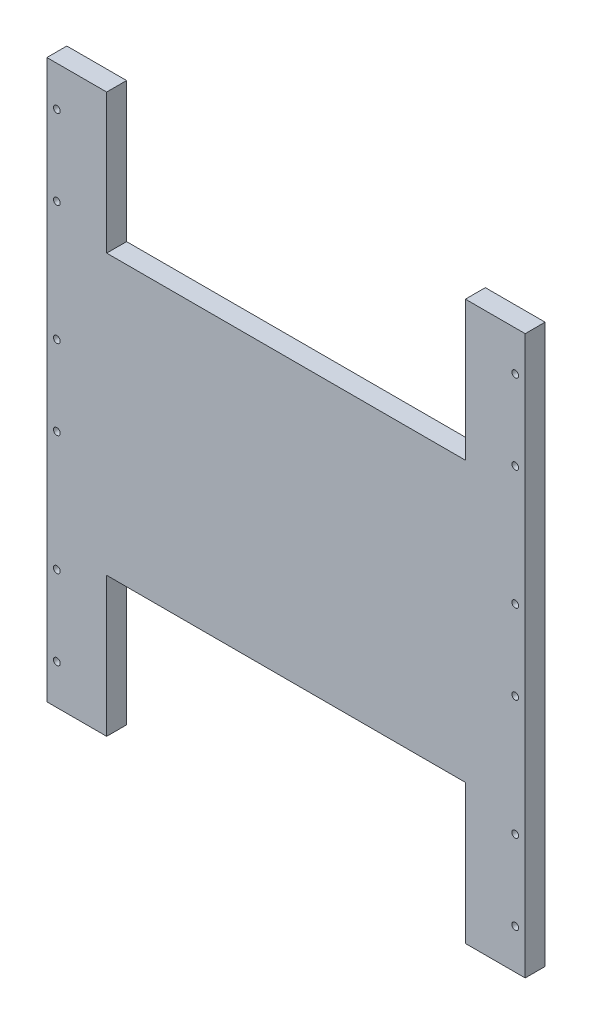
ISO-10303-21;
HEADER;
FILE_DESCRIPTION(('STEP AP214'),'2;1');
FILE_NAME('part.step','',(''),(''),'','','');
FILE_SCHEMA(('AUTOMOTIVE_DESIGN { 1 0 10303 214 1 1 1 1 }'));
ENDSEC;
DATA;
#1=APPLICATION_CONTEXT('core data for automotive mechanical design processes');
#2=APPLICATION_PROTOCOL_DEFINITION('international standard','automotive_design',2000,#1);
#3=PRODUCT_CONTEXT('',#1,'mechanical');
#4=PRODUCT('Part','Part','',(#3));
#5=PRODUCT_RELATED_PRODUCT_CATEGORY('part','',(#4));
#6=PRODUCT_DEFINITION_FORMATION('','',#4);
#7=PRODUCT_DEFINITION_CONTEXT('part definition',#1,'design');
#8=PRODUCT_DEFINITION('design','',#6,#7);
#9=PRODUCT_DEFINITION_SHAPE('','',#8);
#10=(LENGTH_UNIT() NAMED_UNIT(*) SI_UNIT(.MILLI.,.METRE.));
#11=(NAMED_UNIT(*) PLANE_ANGLE_UNIT() SI_UNIT($,.RADIAN.));
#12=(NAMED_UNIT(*) SI_UNIT($,.STERADIAN.) SOLID_ANGLE_UNIT());
#13=UNCERTAINTY_MEASURE_WITH_UNIT(LENGTH_MEASURE(1.E-05),#10,'distance_accuracy_value','');
#14=(GEOMETRIC_REPRESENTATION_CONTEXT(3) GLOBAL_UNCERTAINTY_ASSIGNED_CONTEXT((#13)) GLOBAL_UNIT_ASSIGNED_CONTEXT((#10,
#11,#12)) REPRESENTATION_CONTEXT('',''));
#15=CARTESIAN_POINT('',(0.,0.,0.));
#16=DIRECTION('',(0.,0.,1.));
#17=DIRECTION('',(1.,0.,0.));
#18=AXIS2_PLACEMENT_3D('',#15,#16,#17);
#19=CARTESIAN_POINT('',(0.,355.6,12.7));
#20=DIRECTION('',(0.,-1.,0.));
#21=DIRECTION('',(0.,0.,-1.));
#22=AXIS2_PLACEMENT_3D('',#19,#20,#21);
#23=PLANE('',#22);
#24=DIRECTION('',(-1.,0.,0.));
#25=VECTOR('',#24,1.);
#26=CARTESIAN_POINT('',(0.,355.6,12.7));
#27=LINE('',#26,#25);
#28=CARTESIAN_POINT('',(38.0999999999999,355.6,12.7));
#29=VERTEX_POINT('',#28);
#30=CARTESIAN_POINT('',(0.,355.6,12.7));
#31=VERTEX_POINT('',#30);
#32=EDGE_CURVE('E195',#29,#31,#27,.T.);
#33=ORIENTED_EDGE('',*,*,#32,.F.);
#34=DIRECTION('',(0.,0.,1.));
#35=VECTOR('',#34,1.);
#36=CARTESIAN_POINT('',(38.0999999999999,355.6,0.));
#37=LINE('',#36,#35);
#38=CARTESIAN_POINT('',(38.0999999999999,355.6,0.));
#39=VERTEX_POINT('',#38);
#40=EDGE_CURVE('E154',#39,#29,#37,.T.);
#41=ORIENTED_EDGE('',*,*,#40,.F.);
#42=DIRECTION('',(-1.,0.,0.));
#43=VECTOR('',#42,1.);
#44=CARTESIAN_POINT('',(0.,355.6,0.));
#45=LINE('',#44,#43);
#46=CARTESIAN_POINT('',(0.,355.6,0.));
#47=VERTEX_POINT('',#46);
#48=EDGE_CURVE('E141',#39,#47,#45,.T.);
#49=ORIENTED_EDGE('',*,*,#48,.T.);
#50=DIRECTION('',(0.,0.,-1.));
#51=VECTOR('',#50,1.);
#52=CARTESIAN_POINT('',(0.,355.6,12.7));
#53=LINE('',#52,#51);
#54=EDGE_CURVE('E199',#31,#47,#53,.T.);
#55=ORIENTED_EDGE('',*,*,#54,.F.);
#56=EDGE_LOOP('',(#33,#41,#49,#55));
#57=FACE_BOUND('',#56,.T.);
#58=ADVANCED_FACE('F32',(#57),#23,.F.);
#59=CARTESIAN_POINT('',(0.,0.,12.7));
#60=DIRECTION('',(0.,1.,0.));
#61=DIRECTION('',(0.,0.,1.));
#62=AXIS2_PLACEMENT_3D('',#59,#60,#61);
#63=PLANE('',#62);
#64=DIRECTION('',(1.,0.,0.));
#65=VECTOR('',#64,1.);
#66=CARTESIAN_POINT('',(0.,0.,0.));
#67=LINE('',#66,#65);
#68=CARTESIAN_POINT('',(0.,0.,0.));
#69=VERTEX_POINT('',#68);
#70=CARTESIAN_POINT('',(38.0999999999999,0.,0.));
#71=VERTEX_POINT('',#70);
#72=EDGE_CURVE('E203',#69,#71,#67,.T.);
#73=ORIENTED_EDGE('',*,*,#72,.T.);
#74=DIRECTION('',(0.,0.,1.));
#75=VECTOR('',#74,1.);
#76=CARTESIAN_POINT('',(38.0999999999999,0.,0.));
#77=LINE('',#76,#75);
#78=CARTESIAN_POINT('',(38.0999999999999,0.,12.7));
#79=VERTEX_POINT('',#78);
#80=EDGE_CURVE('E169',#71,#79,#77,.T.);
#81=ORIENTED_EDGE('',*,*,#80,.T.);
#82=DIRECTION('',(1.,0.,0.));
#83=VECTOR('',#82,1.);
#84=CARTESIAN_POINT('',(0.,0.,12.7));
#85=LINE('',#84,#83);
#86=CARTESIAN_POINT('',(0.,0.,12.7));
#87=VERTEX_POINT('',#86);
#88=EDGE_CURVE('E190',#87,#79,#85,.T.);
#89=ORIENTED_EDGE('',*,*,#88,.F.);
#90=DIRECTION('',(0.,0.,-1.));
#91=VECTOR('',#90,1.);
#92=CARTESIAN_POINT('',(0.,0.,12.7));
#93=LINE('',#92,#91);
#94=EDGE_CURVE('E11',#87,#69,#93,.T.);
#95=ORIENTED_EDGE('',*,*,#94,.T.);
#96=EDGE_LOOP('',(#73,#81,#89,#95));
#97=FACE_BOUND('',#96,.T.);
#98=ADVANCED_FACE('F240',(#97),#63,.F.);
#99=CARTESIAN_POINT('',(0.,0.,12.7));
#100=DIRECTION('',(1.,0.,0.));
#101=DIRECTION('',(0.,0.,-1.));
#102=AXIS2_PLACEMENT_3D('',#99,#100,#101);
#103=PLANE('',#102);
#104=DIRECTION('',(0.,-1.,0.));
#105=VECTOR('',#104,1.);
#106=CARTESIAN_POINT('',(0.,0.,0.));
#107=LINE('',#106,#105);
#108=EDGE_CURVE('E178',#47,#69,#107,.T.);
#109=ORIENTED_EDGE('',*,*,#108,.T.);
#110=ORIENTED_EDGE('',*,*,#94,.F.);
#111=DIRECTION('',(0.,-1.,0.));
#112=VECTOR('',#111,1.);
#113=CARTESIAN_POINT('',(0.,0.,12.7));
#114=LINE('',#113,#112);
#115=EDGE_CURVE('E185',#31,#87,#114,.T.);
#116=ORIENTED_EDGE('',*,*,#115,.F.);
#117=ORIENTED_EDGE('',*,*,#54,.T.);
#118=EDGE_LOOP('',(#109,#110,#116,#117));
#119=FACE_BOUND('',#118,.T.);
#120=ADVANCED_FACE('F34',(#119),#103,.F.);
#121=CARTESIAN_POINT('',(266.7,0.,12.7));
#122=VERTEX_POINT('',#121);
#123=CARTESIAN_POINT('',(304.8,0.,12.7));
#124=VERTEX_POINT('',#123);
#125=EDGE_CURVE('E188',#122,#124,#85,.T.);
#126=ORIENTED_EDGE('',*,*,#125,.F.);
#127=DIRECTION('',(0.,0.,1.));
#128=VECTOR('',#127,1.);
#129=CARTESIAN_POINT('',(266.7,0.,0.));
#130=LINE('',#129,#128);
#131=CARTESIAN_POINT('',(266.7,0.,0.));
#132=VERTEX_POINT('',#131);
#133=EDGE_CURVE('E181',#132,#122,#130,.T.);
#134=ORIENTED_EDGE('',*,*,#133,.F.);
#135=CARTESIAN_POINT('',(304.8,0.,0.));
#136=VERTEX_POINT('',#135);
#137=EDGE_CURVE('E202',#132,#136,#67,.T.);
#138=ORIENTED_EDGE('',*,*,#137,.T.);
#139=DIRECTION('',(0.,0.,-1.));
#140=VECTOR('',#139,1.);
#141=CARTESIAN_POINT('',(304.8,0.,12.7));
#142=LINE('',#141,#140);
#143=EDGE_CURVE('E40',#124,#136,#142,.T.);
#144=ORIENTED_EDGE('',*,*,#143,.F.);
#145=EDGE_LOOP('',(#126,#134,#138,#144));
#146=FACE_BOUND('',#145,.T.);
#147=ADVANCED_FACE('F234',(#146),#63,.F.);
#148=CARTESIAN_POINT('',(304.8,0.,12.7));
#149=DIRECTION('',(-1.,0.,0.));
#150=DIRECTION('',(0.,0.,1.));
#151=AXIS2_PLACEMENT_3D('',#148,#149,#150);
#152=PLANE('',#151);
#153=DIRECTION('',(0.,1.,0.));
#154=VECTOR('',#153,1.);
#155=CARTESIAN_POINT('',(304.8,0.,0.));
#156=LINE('',#155,#154);
#157=CARTESIAN_POINT('',(304.8,355.6,0.));
#158=VERTEX_POINT('',#157);
#159=EDGE_CURVE('E206',#136,#158,#156,.T.);
#160=ORIENTED_EDGE('',*,*,#159,.T.);
#161=DIRECTION('',(0.,0.,-1.));
#162=VECTOR('',#161,1.);
#163=CARTESIAN_POINT('',(304.8,355.6,12.7));
#164=LINE('',#163,#162);
#165=CARTESIAN_POINT('',(304.8,355.6,12.7));
#166=VERTEX_POINT('',#165);
#167=EDGE_CURVE('E212',#166,#158,#164,.T.);
#168=ORIENTED_EDGE('',*,*,#167,.F.);
#169=DIRECTION('',(0.,1.,0.));
#170=VECTOR('',#169,1.);
#171=CARTESIAN_POINT('',(304.8,0.,12.7));
#172=LINE('',#171,#170);
#173=EDGE_CURVE('E193',#124,#166,#172,.T.);
#174=ORIENTED_EDGE('',*,*,#173,.F.);
#175=ORIENTED_EDGE('',*,*,#143,.T.);
#176=EDGE_LOOP('',(#160,#168,#174,#175));
#177=FACE_BOUND('',#176,.T.);
#178=ADVANCED_FACE('F219',(#177),#152,.F.);
#179=CARTESIAN_POINT('',(266.7,355.6,0.));
#180=VERTEX_POINT('',#179);
#181=EDGE_CURVE('E189',#158,#180,#45,.T.);
#182=ORIENTED_EDGE('',*,*,#181,.T.);
#183=DIRECTION('',(0.,0.,1.));
#184=VECTOR('',#183,1.);
#185=CARTESIAN_POINT('',(266.7,355.6,0.));
#186=LINE('',#185,#184);
#187=CARTESIAN_POINT('',(266.7,355.6,12.7));
#188=VERTEX_POINT('',#187);
#189=EDGE_CURVE('E157',#180,#188,#186,.T.);
#190=ORIENTED_EDGE('',*,*,#189,.T.);
#191=EDGE_CURVE('E196',#166,#188,#27,.T.);
#192=ORIENTED_EDGE('',*,*,#191,.F.);
#193=ORIENTED_EDGE('',*,*,#167,.T.);
#194=EDGE_LOOP('',(#182,#190,#192,#193));
#195=FACE_BOUND('',#194,.T.);
#196=ADVANCED_FACE('F226',(#195),#23,.F.);
#197=CARTESIAN_POINT('',(0.,0.,12.7));
#198=DIRECTION('',(0.,0.,-1.));
#199=DIRECTION('',(-1.,0.,0.));
#200=AXIS2_PLACEMENT_3D('',#197,#198,#199);
#201=PLANE('',#200);
#202=CARTESIAN_POINT('',(298.45,203.2,12.7));
#203=DIRECTION('',(0.,0.,1.));
#204=DIRECTION('',(1.,0.,0.));
#205=AXIS2_PLACEMENT_3D('',#202,#203,#204);
#206=CIRCLE('',#205,2.15900000000003);
#207=CARTESIAN_POINT('',(300.609,203.2,12.7));
#208=VERTEX_POINT('',#207);
#209=EDGE_CURVE('E480',#208,#208,#206,.T.);
#210=ORIENTED_EDGE('',*,*,#209,.F.);
#211=EDGE_LOOP('',(#210));
#212=FACE_BOUND('',#211,.T.);
#213=CARTESIAN_POINT('',(298.45,152.4,12.7));
#214=DIRECTION('',(0.,0.,1.));
#215=DIRECTION('',(1.,0.,0.));
#216=AXIS2_PLACEMENT_3D('',#213,#214,#215);
#217=CIRCLE('',#216,2.15899999999998);
#218=CARTESIAN_POINT('',(300.609,152.4,12.7));
#219=VERTEX_POINT('',#218);
#220=EDGE_CURVE('E482',#219,#219,#217,.T.);
#221=ORIENTED_EDGE('',*,*,#220,.F.);
#222=EDGE_LOOP('',(#221));
#223=FACE_BOUND('',#222,.T.);
#224=CARTESIAN_POINT('',(6.34999999999996,152.4,12.7));
#225=DIRECTION('',(0.,0.,1.));
#226=DIRECTION('',(-1.,0.,0.));
#227=AXIS2_PLACEMENT_3D('',#224,#225,#226);
#228=CIRCLE('',#227,2.15900000000002);
#229=CARTESIAN_POINT('',(4.19099999999994,152.4,12.7));
#230=VERTEX_POINT('',#229);
#231=EDGE_CURVE('E488',#230,#230,#228,.T.);
#232=ORIENTED_EDGE('',*,*,#231,.F.);
#233=EDGE_LOOP('',(#232));
#234=FACE_BOUND('',#233,.T.);
#235=CARTESIAN_POINT('',(6.35000000000001,203.2,12.7));
#236=DIRECTION('',(0.,0.,1.));
#237=DIRECTION('',(-1.,0.,0.));
#238=AXIS2_PLACEMENT_3D('',#235,#236,#237);
#239=CIRCLE('',#238,2.15900000000002);
#240=CARTESIAN_POINT('',(4.19099999999999,203.2,12.7));
#241=VERTEX_POINT('',#240);
#242=EDGE_CURVE('E494',#241,#241,#239,.T.);
#243=ORIENTED_EDGE('',*,*,#242,.F.);
#244=EDGE_LOOP('',(#243));
#245=FACE_BOUND('',#244,.T.);
#246=CARTESIAN_POINT('',(298.45,330.2,12.7));
#247=DIRECTION('',(0.,0.,1.));
#248=DIRECTION('',(-1.,0.,0.));
#249=AXIS2_PLACEMENT_3D('',#246,#247,#248);
#250=CIRCLE('',#249,2.15899999999997);
#251=CARTESIAN_POINT('',(296.291,330.2,12.7));
#252=VERTEX_POINT('',#251);
#253=EDGE_CURVE('E500',#252,#252,#250,.T.);
#254=ORIENTED_EDGE('',*,*,#253,.F.);
#255=EDGE_LOOP('',(#254));
#256=FACE_BOUND('',#255,.T.);
#257=CARTESIAN_POINT('',(298.45,279.4,12.7));
#258=DIRECTION('',(0.,0.,1.));
#259=DIRECTION('',(-1.,0.,0.));
#260=AXIS2_PLACEMENT_3D('',#257,#258,#259);
#261=CIRCLE('',#260,2.15899999999997);
#262=CARTESIAN_POINT('',(296.291,279.4,12.7));
#263=VERTEX_POINT('',#262);
#264=EDGE_CURVE('E506',#263,#263,#261,.T.);
#265=ORIENTED_EDGE('',*,*,#264,.F.);
#266=EDGE_LOOP('',(#265));
#267=FACE_BOUND('',#266,.T.);
#268=CARTESIAN_POINT('',(298.45,76.2000000000001,12.7));
#269=DIRECTION('',(0.,0.,1.));
#270=DIRECTION('',(1.,0.,0.));
#271=AXIS2_PLACEMENT_3D('',#268,#269,#270);
#272=CIRCLE('',#271,2.15899999999996);
#273=CARTESIAN_POINT('',(300.609,76.2000000000001,12.7));
#274=VERTEX_POINT('',#273);
#275=EDGE_CURVE('E512',#274,#274,#272,.T.);
#276=ORIENTED_EDGE('',*,*,#275,.F.);
#277=EDGE_LOOP('',(#276));
#278=FACE_BOUND('',#277,.T.);
#279=CARTESIAN_POINT('',(298.45,25.4000000000001,12.7));
#280=DIRECTION('',(0.,0.,1.));
#281=DIRECTION('',(1.,0.,0.));
#282=AXIS2_PLACEMENT_3D('',#279,#280,#281);
#283=CIRCLE('',#282,2.15899999999997);
#284=CARTESIAN_POINT('',(300.609,25.4000000000001,12.7));
#285=VERTEX_POINT('',#284);
#286=EDGE_CURVE('E518',#285,#285,#283,.T.);
#287=ORIENTED_EDGE('',*,*,#286,.F.);
#288=EDGE_LOOP('',(#287));
#289=FACE_BOUND('',#288,.T.);
#290=CARTESIAN_POINT('',(6.34999999999996,25.4000000000001,12.7));
#291=DIRECTION('',(0.,0.,1.));
#292=DIRECTION('',(-1.,0.,0.));
#293=AXIS2_PLACEMENT_3D('',#290,#291,#292);
#294=CIRCLE('',#293,2.15900000000002);
#295=CARTESIAN_POINT('',(4.19099999999994,25.4000000000001,12.7));
#296=VERTEX_POINT('',#295);
#297=EDGE_CURVE('E524',#296,#296,#294,.T.);
#298=ORIENTED_EDGE('',*,*,#297,.F.);
#299=EDGE_LOOP('',(#298));
#300=FACE_BOUND('',#299,.T.);
#301=CARTESIAN_POINT('',(6.35000000000001,76.2,12.7));
#302=DIRECTION('',(0.,0.,1.));
#303=DIRECTION('',(-1.,0.,0.));
#304=AXIS2_PLACEMENT_3D('',#301,#302,#303);
#305=CIRCLE('',#304,2.15900000000001);
#306=CARTESIAN_POINT('',(4.191,76.2,12.7));
#307=VERTEX_POINT('',#306);
#308=EDGE_CURVE('E530',#307,#307,#305,.T.);
#309=ORIENTED_EDGE('',*,*,#308,.F.);
#310=EDGE_LOOP('',(#309));
#311=FACE_BOUND('',#310,.T.);
#312=CARTESIAN_POINT('',(6.35000000000001,279.4,12.7));
#313=DIRECTION('',(0.,0.,1.));
#314=DIRECTION('',(1.,0.,0.));
#315=AXIS2_PLACEMENT_3D('',#312,#313,#314);
#316=CIRCLE('',#315,2.15900000000002);
#317=CARTESIAN_POINT('',(8.50900000000003,279.4,12.7));
#318=VERTEX_POINT('',#317);
#319=EDGE_CURVE('E536',#318,#318,#316,.T.);
#320=ORIENTED_EDGE('',*,*,#319,.F.);
#321=EDGE_LOOP('',(#320));
#322=FACE_BOUND('',#321,.T.);
#323=CARTESIAN_POINT('',(6.34999999999996,330.2,12.7));
#324=DIRECTION('',(0.,0.,1.));
#325=DIRECTION('',(1.,0.,0.));
#326=AXIS2_PLACEMENT_3D('',#323,#324,#325);
#327=CIRCLE('',#326,2.15900000000002);
#328=CARTESIAN_POINT('',(8.50899999999999,330.2,12.7));
#329=VERTEX_POINT('',#328);
#330=EDGE_CURVE('E147',#329,#329,#327,.T.);
#331=ORIENTED_EDGE('',*,*,#330,.F.);
#332=EDGE_LOOP('',(#331));
#333=FACE_BOUND('',#332,.T.);
#334=DIRECTION('',(1.,0.,0.));
#335=VECTOR('',#334,1.);
#336=CARTESIAN_POINT('',(38.1,266.7,12.7));
#337=LINE('',#336,#335);
#338=CARTESIAN_POINT('',(38.1,266.7,12.7));
#339=VERTEX_POINT('',#338);
#340=CARTESIAN_POINT('',(266.7,266.7,12.7));
#341=VERTEX_POINT('',#340);
#342=EDGE_CURVE('E144',#339,#341,#337,.T.);
#343=ORIENTED_EDGE('',*,*,#342,.F.);
#344=DIRECTION('',(0.,-1.,0.));
#345=VECTOR('',#344,1.);
#346=CARTESIAN_POINT('',(38.0999999999999,355.6,12.7));
#347=LINE('',#346,#345);
#348=EDGE_CURVE('E127',#29,#339,#347,.T.);
#349=ORIENTED_EDGE('',*,*,#348,.F.);
#350=ORIENTED_EDGE('',*,*,#32,.T.);
#351=ORIENTED_EDGE('',*,*,#115,.T.);
#352=ORIENTED_EDGE('',*,*,#88,.T.);
#353=DIRECTION('',(0.,-1.,0.));
#354=VECTOR('',#353,1.);
#355=CARTESIAN_POINT('',(38.0999999999999,0.,12.7));
#356=LINE('',#355,#354);
#357=CARTESIAN_POINT('',(38.1,88.9,12.7));
#358=VERTEX_POINT('',#357);
#359=EDGE_CURVE('E156',#358,#79,#356,.T.);
#360=ORIENTED_EDGE('',*,*,#359,.F.);
#361=DIRECTION('',(-1.,0.,0.));
#362=VECTOR('',#361,1.);
#363=CARTESIAN_POINT('',(38.1,88.9,12.7));
#364=LINE('',#363,#362);
#365=CARTESIAN_POINT('',(266.7,88.9,12.7));
#366=VERTEX_POINT('',#365);
#367=EDGE_CURVE('E165',#366,#358,#364,.T.);
#368=ORIENTED_EDGE('',*,*,#367,.F.);
#369=DIRECTION('',(0.,1.,0.));
#370=VECTOR('',#369,1.);
#371=CARTESIAN_POINT('',(266.7,0.,12.7));
#372=LINE('',#371,#370);
#373=EDGE_CURVE('E171',#122,#366,#372,.T.);
#374=ORIENTED_EDGE('',*,*,#373,.F.);
#375=ORIENTED_EDGE('',*,*,#125,.T.);
#376=ORIENTED_EDGE('',*,*,#173,.T.);
#377=ORIENTED_EDGE('',*,*,#191,.T.);
#378=DIRECTION('',(0.,1.,0.));
#379=VECTOR('',#378,1.);
#380=CARTESIAN_POINT('',(266.7,355.6,12.7));
#381=LINE('',#380,#379);
#382=EDGE_CURVE('E142',#341,#188,#381,.T.);
#383=ORIENTED_EDGE('',*,*,#382,.F.);
#384=EDGE_LOOP('',(#343,#349,#350,#351,#352,#360,#368,#374,#375,#376,#377,#383));
#385=FACE_BOUND('',#384,.T.);
#386=ADVANCED_FACE('F230',(#212,#223,#234,#245,#256,#267,#278,#289,#300,#311,#322,#333,#385),
#201,.F.);
#387=CARTESIAN_POINT('',(0.,0.,0.));
#388=DIRECTION('',(0.,0.,-1.));
#389=DIRECTION('',(-1.,0.,0.));
#390=AXIS2_PLACEMENT_3D('',#387,#388,#389);
#391=PLANE('',#390);
#392=CARTESIAN_POINT('',(298.45,203.2,0.));
#393=DIRECTION('',(0.,0.,1.));
#394=DIRECTION('',(1.,0.,0.));
#395=AXIS2_PLACEMENT_3D('',#392,#393,#394);
#396=CIRCLE('',#395,2.15900000000003);
#397=CARTESIAN_POINT('',(300.609,203.2,0.));
#398=VERTEX_POINT('',#397);
#399=EDGE_CURVE('E477',#398,#398,#396,.T.);
#400=ORIENTED_EDGE('',*,*,#399,.T.);
#401=EDGE_LOOP('',(#400));
#402=FACE_BOUND('',#401,.T.);
#403=CARTESIAN_POINT('',(298.45,152.4,0.));
#404=DIRECTION('',(0.,0.,1.));
#405=DIRECTION('',(1.,0.,0.));
#406=AXIS2_PLACEMENT_3D('',#403,#404,#405);
#407=CIRCLE('',#406,2.15899999999998);
#408=CARTESIAN_POINT('',(300.609,152.4,0.));
#409=VERTEX_POINT('',#408);
#410=EDGE_CURVE('E485',#409,#409,#407,.T.);
#411=ORIENTED_EDGE('',*,*,#410,.T.);
#412=EDGE_LOOP('',(#411));
#413=FACE_BOUND('',#412,.T.);
#414=CARTESIAN_POINT('',(6.34999999999996,152.4,0.));
#415=DIRECTION('',(0.,0.,1.));
#416=DIRECTION('',(-1.,0.,0.));
#417=AXIS2_PLACEMENT_3D('',#414,#415,#416);
#418=CIRCLE('',#417,2.15900000000002);
#419=CARTESIAN_POINT('',(4.19099999999994,152.4,0.));
#420=VERTEX_POINT('',#419);
#421=EDGE_CURVE('E491',#420,#420,#418,.T.);
#422=ORIENTED_EDGE('',*,*,#421,.T.);
#423=EDGE_LOOP('',(#422));
#424=FACE_BOUND('',#423,.T.);
#425=CARTESIAN_POINT('',(6.35000000000001,203.2,0.));
#426=DIRECTION('',(0.,0.,1.));
#427=DIRECTION('',(-1.,0.,0.));
#428=AXIS2_PLACEMENT_3D('',#425,#426,#427);
#429=CIRCLE('',#428,2.15900000000002);
#430=CARTESIAN_POINT('',(4.19099999999999,203.2,0.));
#431=VERTEX_POINT('',#430);
#432=EDGE_CURVE('E497',#431,#431,#429,.T.);
#433=ORIENTED_EDGE('',*,*,#432,.T.);
#434=EDGE_LOOP('',(#433));
#435=FACE_BOUND('',#434,.T.);
#436=CARTESIAN_POINT('',(298.45,330.2,0.));
#437=DIRECTION('',(0.,0.,1.));
#438=DIRECTION('',(-1.,0.,0.));
#439=AXIS2_PLACEMENT_3D('',#436,#437,#438);
#440=CIRCLE('',#439,2.15899999999997);
#441=CARTESIAN_POINT('',(296.291,330.2,0.));
#442=VERTEX_POINT('',#441);
#443=EDGE_CURVE('E503',#442,#442,#440,.T.);
#444=ORIENTED_EDGE('',*,*,#443,.T.);
#445=EDGE_LOOP('',(#444));
#446=FACE_BOUND('',#445,.T.);
#447=CARTESIAN_POINT('',(298.45,279.4,0.));
#448=DIRECTION('',(0.,0.,1.));
#449=DIRECTION('',(-1.,0.,0.));
#450=AXIS2_PLACEMENT_3D('',#447,#448,#449);
#451=CIRCLE('',#450,2.15899999999997);
#452=CARTESIAN_POINT('',(296.291,279.4,0.));
#453=VERTEX_POINT('',#452);
#454=EDGE_CURVE('E509',#453,#453,#451,.T.);
#455=ORIENTED_EDGE('',*,*,#454,.T.);
#456=EDGE_LOOP('',(#455));
#457=FACE_BOUND('',#456,.T.);
#458=CARTESIAN_POINT('',(298.45,76.2000000000001,0.));
#459=DIRECTION('',(0.,0.,1.));
#460=DIRECTION('',(1.,0.,0.));
#461=AXIS2_PLACEMENT_3D('',#458,#459,#460);
#462=CIRCLE('',#461,2.15899999999996);
#463=CARTESIAN_POINT('',(300.609,76.2000000000001,0.));
#464=VERTEX_POINT('',#463);
#465=EDGE_CURVE('E515',#464,#464,#462,.T.);
#466=ORIENTED_EDGE('',*,*,#465,.T.);
#467=EDGE_LOOP('',(#466));
#468=FACE_BOUND('',#467,.T.);
#469=CARTESIAN_POINT('',(298.45,25.4000000000001,0.));
#470=DIRECTION('',(0.,0.,1.));
#471=DIRECTION('',(1.,0.,0.));
#472=AXIS2_PLACEMENT_3D('',#469,#470,#471);
#473=CIRCLE('',#472,2.15899999999997);
#474=CARTESIAN_POINT('',(300.609,25.4000000000001,0.));
#475=VERTEX_POINT('',#474);
#476=EDGE_CURVE('E521',#475,#475,#473,.T.);
#477=ORIENTED_EDGE('',*,*,#476,.T.);
#478=EDGE_LOOP('',(#477));
#479=FACE_BOUND('',#478,.T.);
#480=CARTESIAN_POINT('',(6.34999999999996,25.4000000000001,0.));
#481=DIRECTION('',(0.,0.,1.));
#482=DIRECTION('',(-1.,0.,0.));
#483=AXIS2_PLACEMENT_3D('',#480,#481,#482);
#484=CIRCLE('',#483,2.15900000000002);
#485=CARTESIAN_POINT('',(4.19099999999994,25.4000000000001,0.));
#486=VERTEX_POINT('',#485);
#487=EDGE_CURVE('E527',#486,#486,#484,.T.);
#488=ORIENTED_EDGE('',*,*,#487,.T.);
#489=EDGE_LOOP('',(#488));
#490=FACE_BOUND('',#489,.T.);
#491=CARTESIAN_POINT('',(6.35000000000001,76.2,0.));
#492=DIRECTION('',(0.,0.,1.));
#493=DIRECTION('',(-1.,0.,0.));
#494=AXIS2_PLACEMENT_3D('',#491,#492,#493);
#495=CIRCLE('',#494,2.15900000000001);
#496=CARTESIAN_POINT('',(4.191,76.2,0.));
#497=VERTEX_POINT('',#496);
#498=EDGE_CURVE('E533',#497,#497,#495,.T.);
#499=ORIENTED_EDGE('',*,*,#498,.T.);
#500=EDGE_LOOP('',(#499));
#501=FACE_BOUND('',#500,.T.);
#502=CARTESIAN_POINT('',(6.35000000000001,279.4,0.));
#503=DIRECTION('',(0.,0.,1.));
#504=DIRECTION('',(1.,0.,0.));
#505=AXIS2_PLACEMENT_3D('',#502,#503,#504);
#506=CIRCLE('',#505,2.15900000000002);
#507=CARTESIAN_POINT('',(8.50900000000003,279.4,0.));
#508=VERTEX_POINT('',#507);
#509=EDGE_CURVE('E539',#508,#508,#506,.T.);
#510=ORIENTED_EDGE('',*,*,#509,.T.);
#511=EDGE_LOOP('',(#510));
#512=FACE_BOUND('',#511,.T.);
#513=CARTESIAN_POINT('',(6.34999999999996,330.2,0.));
#514=DIRECTION('',(0.,0.,1.));
#515=DIRECTION('',(1.,0.,0.));
#516=AXIS2_PLACEMENT_3D('',#513,#514,#515);
#517=CIRCLE('',#516,2.15900000000002);
#518=CARTESIAN_POINT('',(8.50899999999999,330.2,0.));
#519=VERTEX_POINT('',#518);
#520=EDGE_CURVE('E152',#519,#519,#517,.T.);
#521=ORIENTED_EDGE('',*,*,#520,.T.);
#522=EDGE_LOOP('',(#521));
#523=FACE_BOUND('',#522,.T.);
#524=DIRECTION('',(0.,-1.,0.));
#525=VECTOR('',#524,1.);
#526=CARTESIAN_POINT('',(38.0999999999999,355.6,0.));
#527=LINE('',#526,#525);
#528=CARTESIAN_POINT('',(38.1,266.7,0.));
#529=VERTEX_POINT('',#528);
#530=EDGE_CURVE('E124',#39,#529,#527,.T.);
#531=ORIENTED_EDGE('',*,*,#530,.T.);
#532=DIRECTION('',(1.,0.,0.));
#533=VECTOR('',#532,1.);
#534=CARTESIAN_POINT('',(38.1,266.7,0.));
#535=LINE('',#534,#533);
#536=CARTESIAN_POINT('',(266.7,266.7,0.));
#537=VERTEX_POINT('',#536);
#538=EDGE_CURVE('E134',#529,#537,#535,.T.);
#539=ORIENTED_EDGE('',*,*,#538,.T.);
#540=DIRECTION('',(0.,1.,0.));
#541=VECTOR('',#540,1.);
#542=CARTESIAN_POINT('',(266.7,355.6,0.));
#543=LINE('',#542,#541);
#544=EDGE_CURVE('E47',#537,#180,#543,.T.);
#545=ORIENTED_EDGE('',*,*,#544,.T.);
#546=ORIENTED_EDGE('',*,*,#181,.F.);
#547=ORIENTED_EDGE('',*,*,#159,.F.);
#548=ORIENTED_EDGE('',*,*,#137,.F.);
#549=DIRECTION('',(0.,1.,0.));
#550=VECTOR('',#549,1.);
#551=CARTESIAN_POINT('',(266.7,0.,0.));
#552=LINE('',#551,#550);
#553=CARTESIAN_POINT('',(266.7,88.9,0.));
#554=VERTEX_POINT('',#553);
#555=EDGE_CURVE('E164',#132,#554,#552,.T.);
#556=ORIENTED_EDGE('',*,*,#555,.T.);
#557=DIRECTION('',(-1.,0.,0.));
#558=VECTOR('',#557,1.);
#559=CARTESIAN_POINT('',(38.1,88.9,0.));
#560=LINE('',#559,#558);
#561=CARTESIAN_POINT('',(38.1,88.9,0.));
#562=VERTEX_POINT('',#561);
#563=EDGE_CURVE('E55',#554,#562,#560,.T.);
#564=ORIENTED_EDGE('',*,*,#563,.T.);
#565=DIRECTION('',(0.,-1.,0.));
#566=VECTOR('',#565,1.);
#567=CARTESIAN_POINT('',(38.0999999999999,0.,0.));
#568=LINE('',#567,#566);
#569=EDGE_CURVE('E161',#562,#71,#568,.T.);
#570=ORIENTED_EDGE('',*,*,#569,.T.);
#571=ORIENTED_EDGE('',*,*,#72,.F.);
#572=ORIENTED_EDGE('',*,*,#108,.F.);
#573=ORIENTED_EDGE('',*,*,#48,.F.);
#574=EDGE_LOOP('',(#531,#539,#545,#546,#547,#548,#556,#564,#570,#571,#572,#573));
#575=FACE_BOUND('',#574,.T.);
#576=ADVANCED_FACE('F139',(#402,#413,#424,#435,#446,#457,#468,#479,#490,#501,#512,#523,#575),
#391,.T.);
#577=CARTESIAN_POINT('',(38.0999999999999,0.,0.));
#578=DIRECTION('',(-1.,0.,0.));
#579=DIRECTION('',(0.,-1.,0.));
#580=AXIS2_PLACEMENT_3D('',#577,#578,#579);
#581=PLANE('',#580);
#582=ORIENTED_EDGE('',*,*,#359,.T.);
#583=ORIENTED_EDGE('',*,*,#80,.F.);
#584=ORIENTED_EDGE('',*,*,#569,.F.);
#585=DIRECTION('',(0.,0.,1.));
#586=VECTOR('',#585,1.);
#587=CARTESIAN_POINT('',(38.1,88.9,0.));
#588=LINE('',#587,#586);
#589=EDGE_CURVE('E176',#562,#358,#588,.T.);
#590=ORIENTED_EDGE('',*,*,#589,.T.);
#591=EDGE_LOOP('',(#582,#583,#584,#590));
#592=FACE_BOUND('',#591,.T.);
#593=ADVANCED_FACE('F248',(#592),#581,.F.);
#594=CARTESIAN_POINT('',(38.1,88.9,0.));
#595=DIRECTION('',(0.,1.,0.));
#596=DIRECTION('',(-1.,0.,0.));
#597=AXIS2_PLACEMENT_3D('',#594,#595,#596);
#598=PLANE('',#597);
#599=ORIENTED_EDGE('',*,*,#367,.T.);
#600=ORIENTED_EDGE('',*,*,#589,.F.);
#601=ORIENTED_EDGE('',*,*,#563,.F.);
#602=DIRECTION('',(0.,0.,1.));
#603=VECTOR('',#602,1.);
#604=CARTESIAN_POINT('',(266.7,88.9,0.));
#605=LINE('',#604,#603);
#606=EDGE_CURVE('E179',#554,#366,#605,.T.);
#607=ORIENTED_EDGE('',*,*,#606,.T.);
#608=EDGE_LOOP('',(#599,#600,#601,#607));
#609=FACE_BOUND('',#608,.T.);
#610=ADVANCED_FACE('F249',(#609),#598,.F.);
#611=CARTESIAN_POINT('',(266.7,0.,0.));
#612=DIRECTION('',(1.,0.,0.));
#613=DIRECTION('',(0.,0.,-1.));
#614=AXIS2_PLACEMENT_3D('',#611,#612,#613);
#615=PLANE('',#614);
#616=ORIENTED_EDGE('',*,*,#373,.T.);
#617=ORIENTED_EDGE('',*,*,#606,.F.);
#618=ORIENTED_EDGE('',*,*,#555,.F.);
#619=ORIENTED_EDGE('',*,*,#133,.T.);
#620=EDGE_LOOP('',(#616,#617,#618,#619));
#621=FACE_BOUND('',#620,.T.);
#622=ADVANCED_FACE('F236',(#621),#615,.F.);
#623=CARTESIAN_POINT('',(38.0999999999999,355.6,0.));
#624=DIRECTION('',(-1.,0.,0.));
#625=DIRECTION('',(0.,-1.,0.));
#626=AXIS2_PLACEMENT_3D('',#623,#624,#625);
#627=PLANE('',#626);
#628=ORIENTED_EDGE('',*,*,#348,.T.);
#629=DIRECTION('',(0.,0.,1.));
#630=VECTOR('',#629,1.);
#631=CARTESIAN_POINT('',(38.1,266.7,0.));
#632=LINE('',#631,#630);
#633=EDGE_CURVE('E120',#529,#339,#632,.T.);
#634=ORIENTED_EDGE('',*,*,#633,.F.);
#635=ORIENTED_EDGE('',*,*,#530,.F.);
#636=ORIENTED_EDGE('',*,*,#40,.T.);
#637=EDGE_LOOP('',(#628,#634,#635,#636));
#638=FACE_BOUND('',#637,.T.);
#639=ADVANCED_FACE('F122',(#638),#627,.F.);
#640=CARTESIAN_POINT('',(266.7,355.6,0.));
#641=DIRECTION('',(1.,0.,0.));
#642=DIRECTION('',(0.,1.,0.));
#643=AXIS2_PLACEMENT_3D('',#640,#641,#642);
#644=PLANE('',#643);
#645=ORIENTED_EDGE('',*,*,#382,.T.);
#646=ORIENTED_EDGE('',*,*,#189,.F.);
#647=ORIENTED_EDGE('',*,*,#544,.F.);
#648=DIRECTION('',(0.,0.,1.));
#649=VECTOR('',#648,1.);
#650=CARTESIAN_POINT('',(266.7,266.7,0.));
#651=LINE('',#650,#649);
#652=EDGE_CURVE('E131',#537,#341,#651,.T.);
#653=ORIENTED_EDGE('',*,*,#652,.T.);
#654=EDGE_LOOP('',(#645,#646,#647,#653));
#655=FACE_BOUND('',#654,.T.);
#656=ADVANCED_FACE('F324',(#655),#644,.F.);
#657=CARTESIAN_POINT('',(38.1,266.7,0.));
#658=DIRECTION('',(0.,-1.,0.));
#659=DIRECTION('',(1.,0.,0.));
#660=AXIS2_PLACEMENT_3D('',#657,#658,#659);
#661=PLANE('',#660);
#662=ORIENTED_EDGE('',*,*,#342,.T.);
#663=ORIENTED_EDGE('',*,*,#652,.F.);
#664=ORIENTED_EDGE('',*,*,#538,.F.);
#665=ORIENTED_EDGE('',*,*,#633,.T.);
#666=EDGE_LOOP('',(#662,#663,#664,#665));
#667=FACE_BOUND('',#666,.T.);
#668=ADVANCED_FACE('F135',(#667),#661,.F.);
#669=CARTESIAN_POINT('',(6.34999999999996,330.2,0.));
#670=DIRECTION('',(0.,0.,1.));
#671=DIRECTION('',(1.,0.,0.));
#672=AXIS2_PLACEMENT_3D('',#669,#670,#671);
#673=CYLINDRICAL_SURFACE('',#672,2.15900000000002);
#674=ORIENTED_EDGE('',*,*,#520,.F.);
#675=EDGE_LOOP('',(#674));
#676=FACE_BOUND('',#675,.T.);
#677=ORIENTED_EDGE('',*,*,#330,.T.);
#678=EDGE_LOOP('',(#677));
#679=FACE_BOUND('',#678,.T.);
#680=ADVANCED_FACE('F340',(#676,#679),#673,.F.);
#681=CARTESIAN_POINT('',(6.35000000000001,279.4,0.));
#682=DIRECTION('',(0.,0.,1.));
#683=DIRECTION('',(1.,0.,0.));
#684=AXIS2_PLACEMENT_3D('',#681,#682,#683);
#685=CYLINDRICAL_SURFACE('',#684,2.15900000000002);
#686=ORIENTED_EDGE('',*,*,#509,.F.);
#687=EDGE_LOOP('',(#686));
#688=FACE_BOUND('',#687,.T.);
#689=ORIENTED_EDGE('',*,*,#319,.T.);
#690=EDGE_LOOP('',(#689));
#691=FACE_BOUND('',#690,.T.);
#692=ADVANCED_FACE('F360',(#688,#691),#685,.F.);
#693=CARTESIAN_POINT('',(6.35000000000001,76.2,0.));
#694=DIRECTION('',(0.,0.,1.));
#695=DIRECTION('',(1.,0.,0.));
#696=AXIS2_PLACEMENT_3D('',#693,#694,#695);
#697=CYLINDRICAL_SURFACE('',#696,2.15900000000001);
#698=ORIENTED_EDGE('',*,*,#498,.F.);
#699=EDGE_LOOP('',(#698));
#700=FACE_BOUND('',#699,.T.);
#701=ORIENTED_EDGE('',*,*,#308,.T.);
#702=EDGE_LOOP('',(#701));
#703=FACE_BOUND('',#702,.T.);
#704=ADVANCED_FACE('F370',(#700,#703),#697,.F.);
#705=CARTESIAN_POINT('',(6.34999999999996,25.4000000000001,0.));
#706=DIRECTION('',(0.,0.,1.));
#707=DIRECTION('',(1.,0.,0.));
#708=AXIS2_PLACEMENT_3D('',#705,#706,#707);
#709=CYLINDRICAL_SURFACE('',#708,2.15900000000002);
#710=ORIENTED_EDGE('',*,*,#487,.F.);
#711=EDGE_LOOP('',(#710));
#712=FACE_BOUND('',#711,.T.);
#713=ORIENTED_EDGE('',*,*,#297,.T.);
#714=EDGE_LOOP('',(#713));
#715=FACE_BOUND('',#714,.T.);
#716=ADVANCED_FACE('F380',(#712,#715),#709,.F.);
#717=CARTESIAN_POINT('',(298.45,25.4000000000001,0.));
#718=DIRECTION('',(0.,0.,1.));
#719=DIRECTION('',(1.,0.,0.));
#720=AXIS2_PLACEMENT_3D('',#717,#718,#719);
#721=CYLINDRICAL_SURFACE('',#720,2.15899999999997);
#722=ORIENTED_EDGE('',*,*,#476,.F.);
#723=EDGE_LOOP('',(#722));
#724=FACE_BOUND('',#723,.T.);
#725=ORIENTED_EDGE('',*,*,#286,.T.);
#726=EDGE_LOOP('',(#725));
#727=FACE_BOUND('',#726,.T.);
#728=ADVANCED_FACE('F390',(#724,#727),#721,.F.);
#729=CARTESIAN_POINT('',(298.45,76.2000000000001,0.));
#730=DIRECTION('',(0.,0.,1.));
#731=DIRECTION('',(1.,0.,0.));
#732=AXIS2_PLACEMENT_3D('',#729,#730,#731);
#733=CYLINDRICAL_SURFACE('',#732,2.15899999999996);
#734=ORIENTED_EDGE('',*,*,#465,.F.);
#735=EDGE_LOOP('',(#734));
#736=FACE_BOUND('',#735,.T.);
#737=ORIENTED_EDGE('',*,*,#275,.T.);
#738=EDGE_LOOP('',(#737));
#739=FACE_BOUND('',#738,.T.);
#740=ADVANCED_FACE('F400',(#736,#739),#733,.F.);
#741=CARTESIAN_POINT('',(298.45,279.4,0.));
#742=DIRECTION('',(0.,0.,1.));
#743=DIRECTION('',(1.,0.,0.));
#744=AXIS2_PLACEMENT_3D('',#741,#742,#743);
#745=CYLINDRICAL_SURFACE('',#744,2.15899999999997);
#746=ORIENTED_EDGE('',*,*,#454,.F.);
#747=EDGE_LOOP('',(#746));
#748=FACE_BOUND('',#747,.T.);
#749=ORIENTED_EDGE('',*,*,#264,.T.);
#750=EDGE_LOOP('',(#749));
#751=FACE_BOUND('',#750,.T.);
#752=ADVANCED_FACE('F410',(#748,#751),#745,.F.);
#753=CARTESIAN_POINT('',(298.45,330.2,0.));
#754=DIRECTION('',(0.,0.,1.));
#755=DIRECTION('',(1.,0.,0.));
#756=AXIS2_PLACEMENT_3D('',#753,#754,#755);
#757=CYLINDRICAL_SURFACE('',#756,2.15899999999997);
#758=ORIENTED_EDGE('',*,*,#443,.F.);
#759=EDGE_LOOP('',(#758));
#760=FACE_BOUND('',#759,.T.);
#761=ORIENTED_EDGE('',*,*,#253,.T.);
#762=EDGE_LOOP('',(#761));
#763=FACE_BOUND('',#762,.T.);
#764=ADVANCED_FACE('F420',(#760,#763),#757,.F.);
#765=CARTESIAN_POINT('',(6.35000000000001,203.2,0.));
#766=DIRECTION('',(0.,0.,1.));
#767=DIRECTION('',(1.,0.,0.));
#768=AXIS2_PLACEMENT_3D('',#765,#766,#767);
#769=CYLINDRICAL_SURFACE('',#768,2.15900000000002);
#770=ORIENTED_EDGE('',*,*,#432,.F.);
#771=EDGE_LOOP('',(#770));
#772=FACE_BOUND('',#771,.T.);
#773=ORIENTED_EDGE('',*,*,#242,.T.);
#774=EDGE_LOOP('',(#773));
#775=FACE_BOUND('',#774,.T.);
#776=ADVANCED_FACE('F430',(#772,#775),#769,.F.);
#777=CARTESIAN_POINT('',(6.34999999999996,152.4,0.));
#778=DIRECTION('',(0.,0.,1.));
#779=DIRECTION('',(1.,0.,0.));
#780=AXIS2_PLACEMENT_3D('',#777,#778,#779);
#781=CYLINDRICAL_SURFACE('',#780,2.15900000000002);
#782=ORIENTED_EDGE('',*,*,#421,.F.);
#783=EDGE_LOOP('',(#782));
#784=FACE_BOUND('',#783,.T.);
#785=ORIENTED_EDGE('',*,*,#231,.T.);
#786=EDGE_LOOP('',(#785));
#787=FACE_BOUND('',#786,.T.);
#788=ADVANCED_FACE('F440',(#784,#787),#781,.F.);
#789=CARTESIAN_POINT('',(298.45,152.4,0.));
#790=DIRECTION('',(0.,0.,1.));
#791=DIRECTION('',(1.,0.,0.));
#792=AXIS2_PLACEMENT_3D('',#789,#790,#791);
#793=CYLINDRICAL_SURFACE('',#792,2.15899999999998);
#794=ORIENTED_EDGE('',*,*,#410,.F.);
#795=EDGE_LOOP('',(#794));
#796=FACE_BOUND('',#795,.T.);
#797=ORIENTED_EDGE('',*,*,#220,.T.);
#798=EDGE_LOOP('',(#797));
#799=FACE_BOUND('',#798,.T.);
#800=ADVANCED_FACE('F450',(#796,#799),#793,.F.);
#801=CARTESIAN_POINT('',(298.45,203.2,0.));
#802=DIRECTION('',(0.,0.,1.));
#803=DIRECTION('',(1.,0.,0.));
#804=AXIS2_PLACEMENT_3D('',#801,#802,#803);
#805=CYLINDRICAL_SURFACE('',#804,2.15900000000003);
#806=ORIENTED_EDGE('',*,*,#399,.F.);
#807=EDGE_LOOP('',(#806));
#808=FACE_BOUND('',#807,.T.);
#809=ORIENTED_EDGE('',*,*,#209,.T.);
#810=EDGE_LOOP('',(#809));
#811=FACE_BOUND('',#810,.T.);
#812=ADVANCED_FACE('F460',(#808,#811),#805,.F.);
#813=CLOSED_SHELL('',(#58,#98,#120,#147,#178,#196,#386,#576,#593,#610,#622,#639,#656,#668,#680,
#692,#704,#716,#728,#740,#752,#764,#776,#788,#800,#812));
#814=MANIFOLD_SOLID_BREP('B2',#813);
#815=ADVANCED_BREP_SHAPE_REPRESENTATION('',(#18,#814),#14);
#816=SHAPE_DEFINITION_REPRESENTATION(#9,#815);
ENDSEC;
END-ISO-10303-21;
